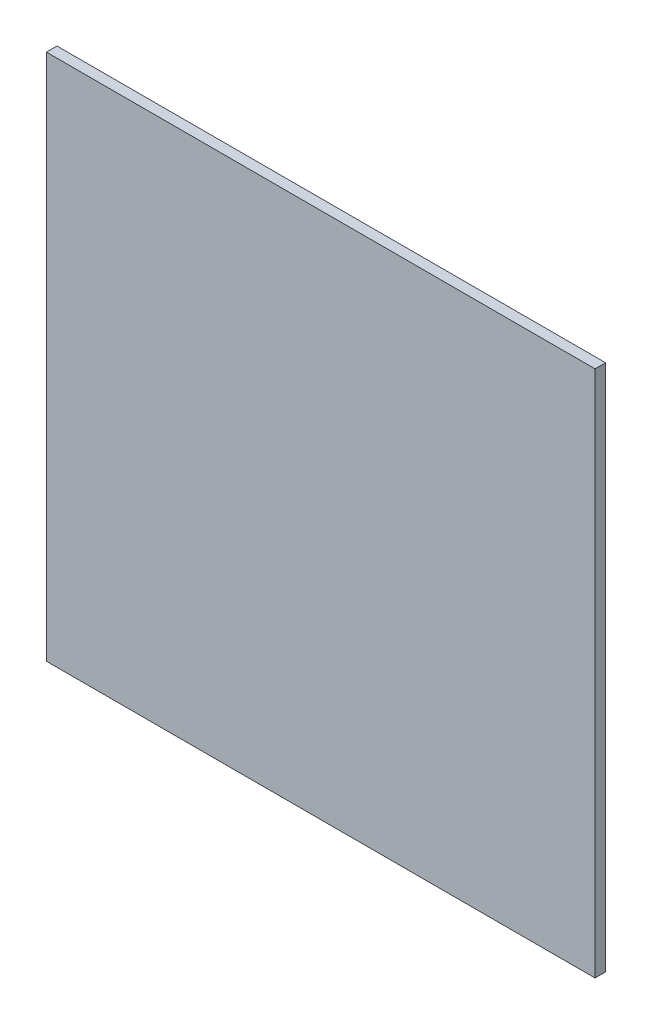
ISO-10303-21;
HEADER;
FILE_DESCRIPTION(('STEP AP214'),'2;1');
FILE_NAME('part.step','',(''),(''),'','','');
FILE_SCHEMA(('AUTOMOTIVE_DESIGN { 1 0 10303 214 1 1 1 1 }'));
ENDSEC;
DATA;
#1=APPLICATION_CONTEXT('core data for automotive mechanical design processes');
#2=APPLICATION_PROTOCOL_DEFINITION('international standard','automotive_design',2000,#1);
#3=PRODUCT_CONTEXT('',#1,'mechanical');
#4=PRODUCT('Part','Part','',(#3));
#5=PRODUCT_RELATED_PRODUCT_CATEGORY('part','',(#4));
#6=PRODUCT_DEFINITION_FORMATION('','',#4);
#7=PRODUCT_DEFINITION_CONTEXT('part definition',#1,'design');
#8=PRODUCT_DEFINITION('design','',#6,#7);
#9=PRODUCT_DEFINITION_SHAPE('','',#8);
#10=(LENGTH_UNIT() NAMED_UNIT(*) SI_UNIT(.MILLI.,.METRE.));
#11=(NAMED_UNIT(*) PLANE_ANGLE_UNIT() SI_UNIT($,.RADIAN.));
#12=(NAMED_UNIT(*) SI_UNIT($,.STERADIAN.) SOLID_ANGLE_UNIT());
#13=UNCERTAINTY_MEASURE_WITH_UNIT(LENGTH_MEASURE(1.E-05),#10,'distance_accuracy_value','');
#14=(GEOMETRIC_REPRESENTATION_CONTEXT(3) GLOBAL_UNCERTAINTY_ASSIGNED_CONTEXT((#13)) GLOBAL_UNIT_ASSIGNED_CONTEXT((#10,
#11,#12)) REPRESENTATION_CONTEXT('',''));
#15=CARTESIAN_POINT('',(0.,0.,0.));
#16=DIRECTION('',(0.,0.,1.));
#17=DIRECTION('',(1.,0.,0.));
#18=AXIS2_PLACEMENT_3D('',#15,#16,#17);
#19=CARTESIAN_POINT('',(-51.8035607890469,165.435334025257,124.340635288145));
#20=DIRECTION('',(1.,0.,0.));
#21=DIRECTION('',(0.,1.,0.));
#22=AXIS2_PLACEMENT_3D('',#19,#20,#21);
#23=PLANE('',#22);
#24=DIRECTION('',(0.,-1.,0.));
#25=VECTOR('',#24,1.);
#26=CARTESIAN_POINT('',(-51.8035607890469,165.435334025257,118.340635288145));
#27=LINE('',#26,#25);
#28=CARTESIAN_POINT('',(-51.8035607890469,165.435334025257,118.340635288145));
#29=VERTEX_POINT('',#28);
#30=CARTESIAN_POINT('',(-51.8035607890469,-134.564665974743,118.340635288145));
#31=VERTEX_POINT('',#30);
#32=EDGE_CURVE('E95',#29,#31,#27,.T.);
#33=ORIENTED_EDGE('',*,*,#32,.T.);
#34=DIRECTION('',(0.,0.,-1.));
#35=VECTOR('',#34,1.);
#36=CARTESIAN_POINT('',(-51.8035607890469,-134.564665974743,124.340635288145));
#37=LINE('',#36,#35);
#38=CARTESIAN_POINT('',(-51.8035607890469,-134.564665974743,124.340635288145));
#39=VERTEX_POINT('',#38);
#40=EDGE_CURVE('E11',#39,#31,#37,.T.);
#41=ORIENTED_EDGE('',*,*,#40,.F.);
#42=DIRECTION('',(0.,-1.,0.));
#43=VECTOR('',#42,1.);
#44=CARTESIAN_POINT('',(-51.8035607890469,165.435334025257,124.340635288145));
#45=LINE('',#44,#43);
#46=CARTESIAN_POINT('',(-51.8035607890469,165.435334025257,124.340635288145));
#47=VERTEX_POINT('',#46);
#48=EDGE_CURVE('E83',#47,#39,#45,.T.);
#49=ORIENTED_EDGE('',*,*,#48,.F.);
#50=DIRECTION('',(0.,0.,-1.));
#51=VECTOR('',#50,1.);
#52=CARTESIAN_POINT('',(-51.8035607890469,165.435334025257,124.340635288145));
#53=LINE('',#52,#51);
#54=EDGE_CURVE('E91',#47,#29,#53,.T.);
#55=ORIENTED_EDGE('',*,*,#54,.T.);
#56=EDGE_LOOP('',(#33,#41,#49,#55));
#57=FACE_BOUND('',#56,.T.);
#58=ADVANCED_FACE('F32',(#57),#23,.F.);
#59=CARTESIAN_POINT('',(-51.8035607890469,-134.564665974743,124.340635288145));
#60=DIRECTION('',(0.,1.,0.));
#61=DIRECTION('',(0.,0.,1.));
#62=AXIS2_PLACEMENT_3D('',#59,#60,#61);
#63=PLANE('',#62);
#64=DIRECTION('',(1.,0.,0.));
#65=VECTOR('',#64,1.);
#66=CARTESIAN_POINT('',(-51.8035607890469,-134.564665974743,118.340635288145));
#67=LINE('',#66,#65);
#68=CARTESIAN_POINT('',(260.196439210953,-134.564665974743,118.340635288145));
#69=VERTEX_POINT('',#68);
#70=EDGE_CURVE('E87',#31,#69,#67,.T.);
#71=ORIENTED_EDGE('',*,*,#70,.T.);
#72=DIRECTION('',(0.,0.,-1.));
#73=VECTOR('',#72,1.);
#74=CARTESIAN_POINT('',(260.196439210953,-134.564665974743,124.340635288145));
#75=LINE('',#74,#73);
#76=CARTESIAN_POINT('',(260.196439210953,-134.564665974743,124.340635288145));
#77=VERTEX_POINT('',#76);
#78=EDGE_CURVE('E40',#77,#69,#75,.T.);
#79=ORIENTED_EDGE('',*,*,#78,.F.);
#80=DIRECTION('',(1.,0.,0.));
#81=VECTOR('',#80,1.);
#82=CARTESIAN_POINT('',(-51.8035607890469,-134.564665974743,124.340635288145));
#83=LINE('',#82,#81);
#84=EDGE_CURVE('E78',#39,#77,#83,.T.);
#85=ORIENTED_EDGE('',*,*,#84,.F.);
#86=ORIENTED_EDGE('',*,*,#40,.T.);
#87=EDGE_LOOP('',(#71,#79,#85,#86));
#88=FACE_BOUND('',#87,.T.);
#89=ADVANCED_FACE('F86',(#88),#63,.F.);
#90=CARTESIAN_POINT('',(260.196439210953,165.435334025257,124.340635288145));
#91=DIRECTION('',(-1.,0.,0.));
#92=DIRECTION('',(0.,0.,1.));
#93=AXIS2_PLACEMENT_3D('',#90,#91,#92);
#94=PLANE('',#93);
#95=DIRECTION('',(0.,1.,0.));
#96=VECTOR('',#95,1.);
#97=CARTESIAN_POINT('',(260.196439210953,165.435334025257,118.340635288145));
#98=LINE('',#97,#96);
#99=CARTESIAN_POINT('',(260.196439210953,165.435334025257,118.340635288145));
#100=VERTEX_POINT('',#99);
#101=EDGE_CURVE('E65',#69,#100,#98,.T.);
#102=ORIENTED_EDGE('',*,*,#101,.T.);
#103=DIRECTION('',(0.,0.,-1.));
#104=VECTOR('',#103,1.);
#105=CARTESIAN_POINT('',(260.196439210953,165.435334025257,124.340635288145));
#106=LINE('',#105,#104);
#107=CARTESIAN_POINT('',(260.196439210953,165.435334025257,124.340635288145));
#108=VERTEX_POINT('',#107);
#109=EDGE_CURVE('E88',#108,#100,#106,.T.);
#110=ORIENTED_EDGE('',*,*,#109,.F.);
#111=DIRECTION('',(0.,1.,0.));
#112=VECTOR('',#111,1.);
#113=CARTESIAN_POINT('',(260.196439210953,165.435334025257,124.340635288145));
#114=LINE('',#113,#112);
#115=EDGE_CURVE('E81',#77,#108,#114,.T.);
#116=ORIENTED_EDGE('',*,*,#115,.F.);
#117=ORIENTED_EDGE('',*,*,#78,.T.);
#118=EDGE_LOOP('',(#102,#110,#116,#117));
#119=FACE_BOUND('',#118,.T.);
#120=ADVANCED_FACE('F89',(#119),#94,.F.);
#121=CARTESIAN_POINT('',(-51.8035607890469,165.435334025257,124.340635288145));
#122=DIRECTION('',(0.,-1.,0.));
#123=DIRECTION('',(0.,0.,-1.));
#124=AXIS2_PLACEMENT_3D('',#121,#122,#123);
#125=PLANE('',#124);
#126=DIRECTION('',(-1.,0.,0.));
#127=VECTOR('',#126,1.);
#128=CARTESIAN_POINT('',(-51.8035607890469,165.435334025257,118.340635288145));
#129=LINE('',#128,#127);
#130=EDGE_CURVE('E71',#100,#29,#129,.T.);
#131=ORIENTED_EDGE('',*,*,#130,.T.);
#132=ORIENTED_EDGE('',*,*,#54,.F.);
#133=DIRECTION('',(-1.,0.,0.));
#134=VECTOR('',#133,1.);
#135=CARTESIAN_POINT('',(-51.8035607890469,165.435334025257,124.340635288145));
#136=LINE('',#135,#134);
#137=EDGE_CURVE('E48',#108,#47,#136,.T.);
#138=ORIENTED_EDGE('',*,*,#137,.F.);
#139=ORIENTED_EDGE('',*,*,#109,.T.);
#140=EDGE_LOOP('',(#131,#132,#138,#139));
#141=FACE_BOUND('',#140,.T.);
#142=ADVANCED_FACE('F102',(#141),#125,.F.);
#143=CARTESIAN_POINT('',(0.,0.,124.340635288145));
#144=DIRECTION('',(0.,0.,1.));
#145=DIRECTION('',(1.,0.,0.));
#146=AXIS2_PLACEMENT_3D('',#143,#144,#145);
#147=PLANE('',#146);
#148=ORIENTED_EDGE('',*,*,#48,.T.);
#149=ORIENTED_EDGE('',*,*,#84,.T.);
#150=ORIENTED_EDGE('',*,*,#115,.T.);
#151=ORIENTED_EDGE('',*,*,#137,.T.);
#152=EDGE_LOOP('',(#148,#149,#150,#151));
#153=FACE_BOUND('',#152,.T.);
#154=ADVANCED_FACE('F79',(#153),#147,.T.);
#155=CARTESIAN_POINT('',(0.,0.,118.340635288145));
#156=DIRECTION('',(0.,0.,1.));
#157=DIRECTION('',(1.,0.,0.));
#158=AXIS2_PLACEMENT_3D('',#155,#156,#157);
#159=PLANE('',#158);
#160=ORIENTED_EDGE('',*,*,#32,.F.);
#161=ORIENTED_EDGE('',*,*,#130,.F.);
#162=ORIENTED_EDGE('',*,*,#101,.F.);
#163=ORIENTED_EDGE('',*,*,#70,.F.);
#164=EDGE_LOOP('',(#160,#161,#162,#163));
#165=FACE_BOUND('',#164,.T.);
#166=ADVANCED_FACE('F105',(#165),#159,.F.);
#167=CLOSED_SHELL('',(#58,#89,#120,#142,#154,#166));
#168=MANIFOLD_SOLID_BREP('B2',#167);
#169=ADVANCED_BREP_SHAPE_REPRESENTATION('',(#18,#168),#14);
#170=SHAPE_DEFINITION_REPRESENTATION(#9,#169);
ENDSEC;
END-ISO-10303-21;
